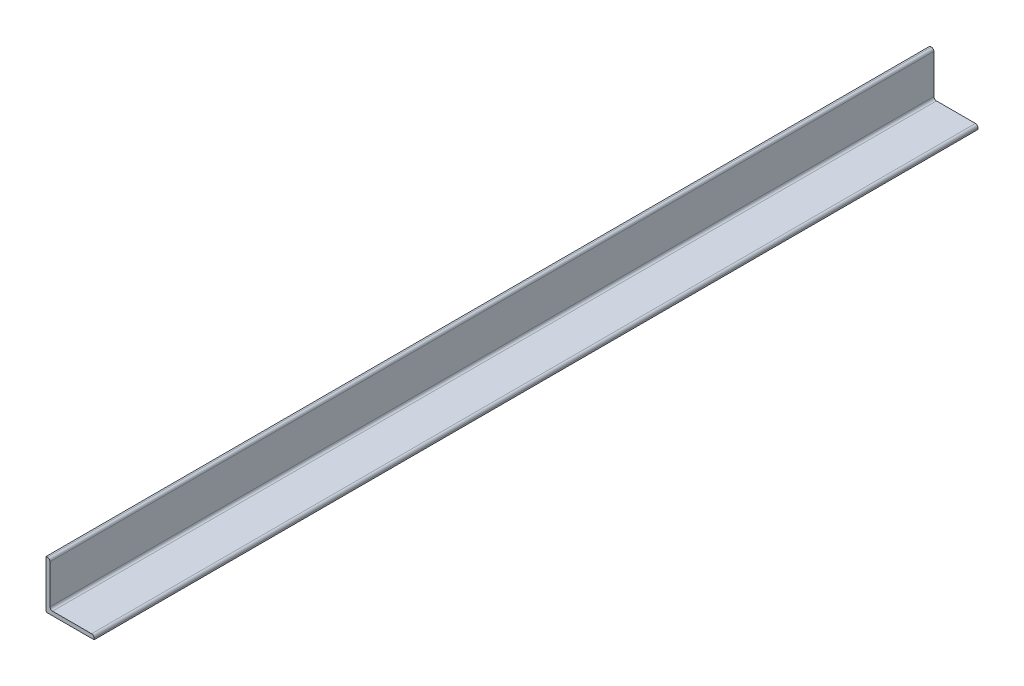
ISO-10303-21;
HEADER;
FILE_DESCRIPTION(('STEP AP214'),'2;1');
FILE_NAME('part.step','',(''),(''),'','','');
FILE_SCHEMA(('AUTOMOTIVE_DESIGN { 1 0 10303 214 1 1 1 1 }'));
ENDSEC;
DATA;
#1=APPLICATION_CONTEXT('core data for automotive mechanical design processes');
#2=APPLICATION_PROTOCOL_DEFINITION('international standard','automotive_design',2000,#1);
#3=PRODUCT_CONTEXT('',#1,'mechanical');
#4=PRODUCT('Part','Part','',(#3));
#5=PRODUCT_RELATED_PRODUCT_CATEGORY('part','',(#4));
#6=PRODUCT_DEFINITION_FORMATION('','',#4);
#7=PRODUCT_DEFINITION_CONTEXT('part definition',#1,'design');
#8=PRODUCT_DEFINITION('design','',#6,#7);
#9=PRODUCT_DEFINITION_SHAPE('','',#8);
#10=(LENGTH_UNIT() NAMED_UNIT(*) SI_UNIT(.MILLI.,.METRE.));
#11=(NAMED_UNIT(*) PLANE_ANGLE_UNIT() SI_UNIT($,.RADIAN.));
#12=(NAMED_UNIT(*) SI_UNIT($,.STERADIAN.) SOLID_ANGLE_UNIT());
#13=UNCERTAINTY_MEASURE_WITH_UNIT(LENGTH_MEASURE(1.E-05),#10,'distance_accuracy_value','');
#14=(GEOMETRIC_REPRESENTATION_CONTEXT(3) GLOBAL_UNCERTAINTY_ASSIGNED_CONTEXT((#13)) GLOBAL_UNIT_ASSIGNED_CONTEXT((#10,
#11,#12)) REPRESENTATION_CONTEXT('',''));
#15=CARTESIAN_POINT('',(0.,0.,0.));
#16=DIRECTION('',(0.,0.,1.));
#17=DIRECTION('',(1.,0.,0.));
#18=AXIS2_PLACEMENT_3D('',#15,#16,#17);
#19=CARTESIAN_POINT('',(19.05,0.,350.));
#20=DIRECTION('',(0.,1.,0.));
#21=DIRECTION('',(-1.,0.,0.));
#22=AXIS2_PLACEMENT_3D('',#19,#20,#21);
#23=PLANE('',#22);
#24=DIRECTION('',(1.,0.,0.));
#25=VECTOR('',#24,1.);
#26=CARTESIAN_POINT('',(19.05,0.,350.));
#27=LINE('',#26,#25);
#28=CARTESIAN_POINT('',(0.500000000000007,0.,350.));
#29=VERTEX_POINT('',#28);
#30=CARTESIAN_POINT('',(19.05,0.,350.));
#31=VERTEX_POINT('',#30);
#32=EDGE_CURVE('E109',#29,#31,#27,.T.);
#33=ORIENTED_EDGE('',*,*,#32,.F.);
#34=DIRECTION('',(0.,0.,-1.));
#35=VECTOR('',#34,1.);
#36=CARTESIAN_POINT('',(0.5,0.,350.));
#37=LINE('',#36,#35);
#38=CARTESIAN_POINT('',(0.500000000000007,0.,0.));
#39=VERTEX_POINT('',#38);
#40=EDGE_CURVE('E165',#29,#39,#37,.T.);
#41=ORIENTED_EDGE('',*,*,#40,.T.);
#42=DIRECTION('',(1.,0.,0.));
#43=VECTOR('',#42,1.);
#44=CARTESIAN_POINT('',(19.05,0.,0.));
#45=LINE('',#44,#43);
#46=CARTESIAN_POINT('',(19.05,0.,0.));
#47=VERTEX_POINT('',#46);
#48=EDGE_CURVE('E130',#39,#47,#45,.T.);
#49=ORIENTED_EDGE('',*,*,#48,.T.);
#50=DIRECTION('',(0.,0.,-1.));
#51=VECTOR('',#50,1.);
#52=CARTESIAN_POINT('',(19.05,0.,350.));
#53=LINE('',#52,#51);
#54=EDGE_CURVE('E125',#31,#47,#53,.T.);
#55=ORIENTED_EDGE('',*,*,#54,.F.);
#56=EDGE_LOOP('',(#33,#41,#49,#55));
#57=FACE_BOUND('',#56,.T.);
#58=ADVANCED_FACE('F32',(#57),#23,.F.);
#59=CARTESIAN_POINT('',(19.05,1.5875,350.));
#60=DIRECTION('',(-1.,0.,0.));
#61=DIRECTION('',(0.,0.,1.));
#62=AXIS2_PLACEMENT_3D('',#59,#60,#61);
#63=PLANE('',#62);
#64=DIRECTION('',(0.,1.,0.));
#65=VECTOR('',#64,1.);
#66=CARTESIAN_POINT('',(19.05,1.5875,0.));
#67=LINE('',#66,#65);
#68=CARTESIAN_POINT('',(19.05,0.5875,0.));
#69=VERTEX_POINT('',#68);
#70=EDGE_CURVE('E169',#47,#69,#67,.T.);
#71=ORIENTED_EDGE('',*,*,#70,.T.);
#72=DIRECTION('',(0.,0.,-1.));
#73=VECTOR('',#72,1.);
#74=CARTESIAN_POINT('',(19.05,0.5875,350.));
#75=LINE('',#74,#73);
#76=CARTESIAN_POINT('',(19.05,0.5875,350.));
#77=VERTEX_POINT('',#76);
#78=EDGE_CURVE('E127',#69,#77,#75,.F.);
#79=ORIENTED_EDGE('',*,*,#78,.T.);
#80=DIRECTION('',(0.,1.,0.));
#81=VECTOR('',#80,1.);
#82=CARTESIAN_POINT('',(19.05,1.5875,350.));
#83=LINE('',#82,#81);
#84=EDGE_CURVE('E112',#31,#77,#83,.T.);
#85=ORIENTED_EDGE('',*,*,#84,.F.);
#86=ORIENTED_EDGE('',*,*,#54,.T.);
#87=EDGE_LOOP('',(#71,#79,#85,#86));
#88=FACE_BOUND('',#87,.T.);
#89=ADVANCED_FACE('F124',(#88),#63,.F.);
#90=CARTESIAN_POINT('',(1.5875,1.5875,350.));
#91=DIRECTION('',(0.,-1.,0.));
#92=DIRECTION('',(0.,0.,-1.));
#93=AXIS2_PLACEMENT_3D('',#90,#91,#92);
#94=PLANE('',#93);
#95=DIRECTION('',(-1.,0.,0.));
#96=VECTOR('',#95,1.);
#97=CARTESIAN_POINT('',(1.5875,1.5875,350.));
#98=LINE('',#97,#96);
#99=CARTESIAN_POINT('',(18.05,1.5875,350.));
#100=VERTEX_POINT('',#99);
#101=CARTESIAN_POINT('',(2.5875,1.5875,350.));
#102=VERTEX_POINT('',#101);
#103=EDGE_CURVE('E128',#100,#102,#98,.T.);
#104=ORIENTED_EDGE('',*,*,#103,.F.);
#105=DIRECTION('',(0.,0.,-1.));
#106=VECTOR('',#105,1.);
#107=CARTESIAN_POINT('',(18.05,1.5875,350.));
#108=LINE('',#107,#106);
#109=CARTESIAN_POINT('',(18.05,1.5875,0.));
#110=VERTEX_POINT('',#109);
#111=EDGE_CURVE('E135',#100,#110,#108,.T.);
#112=ORIENTED_EDGE('',*,*,#111,.T.);
#113=DIRECTION('',(-1.,0.,0.));
#114=VECTOR('',#113,1.);
#115=CARTESIAN_POINT('',(1.5875,1.5875,0.));
#116=LINE('',#115,#114);
#117=CARTESIAN_POINT('',(2.5875,1.5875,0.));
#118=VERTEX_POINT('',#117);
#119=EDGE_CURVE('E171',#110,#118,#116,.T.);
#120=ORIENTED_EDGE('',*,*,#119,.T.);
#121=DIRECTION('',(0.,0.,-1.));
#122=VECTOR('',#121,1.);
#123=CARTESIAN_POINT('',(2.5875,1.5875,350.));
#124=LINE('',#123,#122);
#125=EDGE_CURVE('E132',#118,#102,#124,.F.);
#126=ORIENTED_EDGE('',*,*,#125,.T.);
#127=EDGE_LOOP('',(#104,#112,#120,#126));
#128=FACE_BOUND('',#127,.T.);
#129=ADVANCED_FACE('F197',(#128),#94,.F.);
#130=CARTESIAN_POINT('',(1.5875,19.05,350.));
#131=DIRECTION('',(-1.,0.,0.));
#132=DIRECTION('',(0.,-1.,0.));
#133=AXIS2_PLACEMENT_3D('',#130,#131,#132);
#134=PLANE('',#133);
#135=DIRECTION('',(0.,1.,0.));
#136=VECTOR('',#135,1.);
#137=CARTESIAN_POINT('',(1.5875,19.05,350.));
#138=LINE('',#137,#136);
#139=CARTESIAN_POINT('',(1.5875,2.5875,350.));
#140=VERTEX_POINT('',#139);
#141=CARTESIAN_POINT('',(1.5875,18.05,350.));
#142=VERTEX_POINT('',#141);
#143=EDGE_CURVE('E215',#140,#142,#138,.T.);
#144=ORIENTED_EDGE('',*,*,#143,.F.);
#145=DIRECTION('',(0.,0.,-1.));
#146=VECTOR('',#145,1.);
#147=CARTESIAN_POINT('',(1.5875,2.5875,0.));
#148=LINE('',#147,#146);
#149=CARTESIAN_POINT('',(1.5875,2.5875,0.));
#150=VERTEX_POINT('',#149);
#151=EDGE_CURVE('E155',#140,#150,#148,.T.);
#152=ORIENTED_EDGE('',*,*,#151,.T.);
#153=DIRECTION('',(0.,1.,0.));
#154=VECTOR('',#153,1.);
#155=CARTESIAN_POINT('',(1.5875,19.05,0.));
#156=LINE('',#155,#154);
#157=CARTESIAN_POINT('',(1.5875,18.05,0.));
#158=VERTEX_POINT('',#157);
#159=EDGE_CURVE('E178',#150,#158,#156,.T.);
#160=ORIENTED_EDGE('',*,*,#159,.T.);
#161=DIRECTION('',(0.,0.,-1.));
#162=VECTOR('',#161,1.);
#163=CARTESIAN_POINT('',(1.5875,18.05,350.));
#164=LINE('',#163,#162);
#165=EDGE_CURVE('E153',#158,#142,#164,.F.);
#166=ORIENTED_EDGE('',*,*,#165,.T.);
#167=EDGE_LOOP('',(#144,#152,#160,#166));
#168=FACE_BOUND('',#167,.T.);
#169=ADVANCED_FACE('F219',(#168),#134,.F.);
#170=CARTESIAN_POINT('',(0.,19.05,350.));
#171=DIRECTION('',(0.,-1.,0.));
#172=DIRECTION('',(0.,0.,-1.));
#173=AXIS2_PLACEMENT_3D('',#170,#171,#172);
#174=PLANE('',#173);
#175=DIRECTION('',(-1.,0.,0.));
#176=VECTOR('',#175,1.);
#177=CARTESIAN_POINT('',(0.,19.05,350.));
#178=LINE('',#177,#176);
#179=CARTESIAN_POINT('',(0.5875,19.05,350.));
#180=VERTEX_POINT('',#179);
#181=CARTESIAN_POINT('',(0.,19.05,350.));
#182=VERTEX_POINT('',#181);
#183=EDGE_CURVE('E222',#180,#182,#178,.T.);
#184=ORIENTED_EDGE('',*,*,#183,.F.);
#185=DIRECTION('',(0.,0.,-1.));
#186=VECTOR('',#185,1.);
#187=CARTESIAN_POINT('',(0.5875,19.05,350.));
#188=LINE('',#187,#186);
#189=CARTESIAN_POINT('',(0.5875,19.05,0.));
#190=VERTEX_POINT('',#189);
#191=EDGE_CURVE('E158',#180,#190,#188,.T.);
#192=ORIENTED_EDGE('',*,*,#191,.T.);
#193=DIRECTION('',(-1.,0.,0.));
#194=VECTOR('',#193,1.);
#195=CARTESIAN_POINT('',(0.,19.05,0.));
#196=LINE('',#195,#194);
#197=CARTESIAN_POINT('',(0.,19.05,0.));
#198=VERTEX_POINT('',#197);
#199=EDGE_CURVE('E181',#190,#198,#196,.T.);
#200=ORIENTED_EDGE('',*,*,#199,.T.);
#201=DIRECTION('',(0.,0.,-1.));
#202=VECTOR('',#201,1.);
#203=CARTESIAN_POINT('',(0.,19.05,350.));
#204=LINE('',#203,#202);
#205=EDGE_CURVE('E133',#182,#198,#204,.T.);
#206=ORIENTED_EDGE('',*,*,#205,.F.);
#207=EDGE_LOOP('',(#184,#192,#200,#206));
#208=FACE_BOUND('',#207,.T.);
#209=ADVANCED_FACE('F228',(#208),#174,.F.);
#210=CARTESIAN_POINT('',(0.,0.,350.));
#211=DIRECTION('',(1.,0.,0.));
#212=DIRECTION('',(0.,0.,-1.));
#213=AXIS2_PLACEMENT_3D('',#210,#211,#212);
#214=PLANE('',#213);
#215=DIRECTION('',(0.,-1.,0.));
#216=VECTOR('',#215,1.);
#217=CARTESIAN_POINT('',(0.,0.,0.));
#218=LINE('',#217,#216);
#219=CARTESIAN_POINT('',(0.,0.5,0.));
#220=VERTEX_POINT('',#219);
#221=EDGE_CURVE('E119',#198,#220,#218,.T.);
#222=ORIENTED_EDGE('',*,*,#221,.T.);
#223=DIRECTION('',(0.,0.,-1.));
#224=VECTOR('',#223,1.);
#225=CARTESIAN_POINT('',(0.,0.5,350.));
#226=LINE('',#225,#224);
#227=CARTESIAN_POINT('',(0.,0.5,350.));
#228=VERTEX_POINT('',#227);
#229=EDGE_CURVE('E40',#220,#228,#226,.F.);
#230=ORIENTED_EDGE('',*,*,#229,.T.);
#231=DIRECTION('',(0.,-1.,0.));
#232=VECTOR('',#231,1.);
#233=CARTESIAN_POINT('',(0.,0.,350.));
#234=LINE('',#233,#232);
#235=EDGE_CURVE('E138',#182,#228,#234,.T.);
#236=ORIENTED_EDGE('',*,*,#235,.F.);
#237=ORIENTED_EDGE('',*,*,#205,.T.);
#238=EDGE_LOOP('',(#222,#230,#236,#237));
#239=FACE_BOUND('',#238,.T.);
#240=ADVANCED_FACE('F182',(#239),#214,.F.);
#241=CARTESIAN_POINT('',(0.,0.,350.));
#242=DIRECTION('',(0.,0.,-1.));
#243=DIRECTION('',(-1.,0.,0.));
#244=AXIS2_PLACEMENT_3D('',#241,#242,#243);
#245=PLANE('',#244);
#246=ORIENTED_EDGE('',*,*,#235,.T.);
#247=CARTESIAN_POINT('',(0.5,0.5,350.));
#248=DIRECTION('',(0.,0.,-1.));
#249=DIRECTION('',(-1.,0.,0.));
#250=AXIS2_PLACEMENT_3D('',#247,#248,#249);
#251=CIRCLE('',#250,0.5);
#252=EDGE_CURVE('E11',#228,#29,#251,.F.);
#253=ORIENTED_EDGE('',*,*,#252,.T.);
#254=ORIENTED_EDGE('',*,*,#32,.T.);
#255=ORIENTED_EDGE('',*,*,#84,.T.);
#256=CARTESIAN_POINT('',(18.05,0.5875,350.));
#257=DIRECTION('',(0.,0.,-1.));
#258=DIRECTION('',(-1.,0.,0.));
#259=AXIS2_PLACEMENT_3D('',#256,#257,#258);
#260=CIRCLE('',#259,1.);
#261=EDGE_CURVE('E151',#77,#100,#260,.F.);
#262=ORIENTED_EDGE('',*,*,#261,.T.);
#263=ORIENTED_EDGE('',*,*,#103,.T.);
#264=CARTESIAN_POINT('',(2.5875,2.5875,350.));
#265=DIRECTION('',(0.,0.,-1.));
#266=DIRECTION('',(-1.,0.,0.));
#267=AXIS2_PLACEMENT_3D('',#264,#265,#266);
#268=CIRCLE('',#267,1.);
#269=EDGE_CURVE('E163',#102,#140,#268,.T.);
#270=ORIENTED_EDGE('',*,*,#269,.T.);
#271=ORIENTED_EDGE('',*,*,#143,.T.);
#272=CARTESIAN_POINT('',(0.5875,18.05,350.));
#273=DIRECTION('',(0.,0.,-1.));
#274=DIRECTION('',(-1.,0.,0.));
#275=AXIS2_PLACEMENT_3D('',#272,#273,#274);
#276=CIRCLE('',#275,1.);
#277=EDGE_CURVE('E149',#142,#180,#276,.F.);
#278=ORIENTED_EDGE('',*,*,#277,.T.);
#279=ORIENTED_EDGE('',*,*,#183,.T.);
#280=EDGE_LOOP('',(#246,#253,#254,#255,#262,#263,#270,#271,#278,#279));
#281=FACE_BOUND('',#280,.T.);
#282=ADVANCED_FACE('F111',(#281),#245,.F.);
#283=CARTESIAN_POINT('',(0.,0.,0.));
#284=DIRECTION('',(0.,0.,-1.));
#285=DIRECTION('',(-1.,0.,0.));
#286=AXIS2_PLACEMENT_3D('',#283,#284,#285);
#287=PLANE('',#286);
#288=ORIENTED_EDGE('',*,*,#48,.F.);
#289=CARTESIAN_POINT('',(0.5,0.5,0.));
#290=DIRECTION('',(0.,0.,-1.));
#291=DIRECTION('',(-1.,0.,0.));
#292=AXIS2_PLACEMENT_3D('',#289,#290,#291);
#293=CIRCLE('',#292,0.5);
#294=EDGE_CURVE('E54',#39,#220,#293,.T.);
#295=ORIENTED_EDGE('',*,*,#294,.T.);
#296=ORIENTED_EDGE('',*,*,#221,.F.);
#297=ORIENTED_EDGE('',*,*,#199,.F.);
#298=CARTESIAN_POINT('',(0.5875,18.05,0.));
#299=DIRECTION('',(0.,0.,-1.));
#300=DIRECTION('',(-1.,0.,0.));
#301=AXIS2_PLACEMENT_3D('',#298,#299,#300);
#302=CIRCLE('',#301,1.);
#303=EDGE_CURVE('E144',#190,#158,#302,.T.);
#304=ORIENTED_EDGE('',*,*,#303,.T.);
#305=ORIENTED_EDGE('',*,*,#159,.F.);
#306=CARTESIAN_POINT('',(2.5875,2.5875,0.));
#307=DIRECTION('',(0.,0.,-1.));
#308=DIRECTION('',(-1.,0.,0.));
#309=AXIS2_PLACEMENT_3D('',#306,#307,#308);
#310=CIRCLE('',#309,1.);
#311=EDGE_CURVE('E161',#150,#118,#310,.F.);
#312=ORIENTED_EDGE('',*,*,#311,.T.);
#313=ORIENTED_EDGE('',*,*,#119,.F.);
#314=CARTESIAN_POINT('',(18.05,0.5875,0.));
#315=DIRECTION('',(0.,0.,-1.));
#316=DIRECTION('',(-1.,0.,0.));
#317=AXIS2_PLACEMENT_3D('',#314,#315,#316);
#318=CIRCLE('',#317,1.);
#319=EDGE_CURVE('E146',#110,#69,#318,.T.);
#320=ORIENTED_EDGE('',*,*,#319,.T.);
#321=ORIENTED_EDGE('',*,*,#70,.F.);
#322=EDGE_LOOP('',(#288,#295,#296,#297,#304,#305,#312,#313,#320,#321));
#323=FACE_BOUND('',#322,.T.);
#324=ADVANCED_FACE('F168',(#323),#287,.T.);
#325=CARTESIAN_POINT('',(18.05,0.5875,350.));
#326=DIRECTION('',(0.,0.,-1.));
#327=DIRECTION('',(-1.,0.,0.));
#328=AXIS2_PLACEMENT_3D('',#325,#326,#327);
#329=CYLINDRICAL_SURFACE('',#328,1.);
#330=ORIENTED_EDGE('',*,*,#261,.F.);
#331=ORIENTED_EDGE('',*,*,#78,.F.);
#332=ORIENTED_EDGE('',*,*,#319,.F.);
#333=ORIENTED_EDGE('',*,*,#111,.F.);
#334=EDGE_LOOP('',(#330,#331,#332,#333));
#335=FACE_BOUND('',#334,.T.);
#336=ADVANCED_FACE('F201',(#335),#329,.T.);
#337=CARTESIAN_POINT('',(2.5875,2.5875,350.));
#338=DIRECTION('',(0.,0.,1.));
#339=DIRECTION('',(1.,0.,0.));
#340=AXIS2_PLACEMENT_3D('',#337,#338,#339);
#341=CYLINDRICAL_SURFACE('',#340,1.);
#342=ORIENTED_EDGE('',*,*,#269,.F.);
#343=ORIENTED_EDGE('',*,*,#125,.F.);
#344=ORIENTED_EDGE('',*,*,#311,.F.);
#345=ORIENTED_EDGE('',*,*,#151,.F.);
#346=EDGE_LOOP('',(#342,#343,#344,#345));
#347=FACE_BOUND('',#346,.T.);
#348=ADVANCED_FACE('F190',(#347),#341,.F.);
#349=CARTESIAN_POINT('',(0.5875,18.05,350.));
#350=DIRECTION('',(0.,0.,-1.));
#351=DIRECTION('',(-1.,0.,0.));
#352=AXIS2_PLACEMENT_3D('',#349,#350,#351);
#353=CYLINDRICAL_SURFACE('',#352,1.);
#354=ORIENTED_EDGE('',*,*,#277,.F.);
#355=ORIENTED_EDGE('',*,*,#165,.F.);
#356=ORIENTED_EDGE('',*,*,#303,.F.);
#357=ORIENTED_EDGE('',*,*,#191,.F.);
#358=EDGE_LOOP('',(#354,#355,#356,#357));
#359=FACE_BOUND('',#358,.T.);
#360=ADVANCED_FACE('F186',(#359),#353,.T.);
#361=CARTESIAN_POINT('',(0.5,0.5,350.));
#362=DIRECTION('',(0.,0.,-1.));
#363=DIRECTION('',(-1.,0.,0.));
#364=AXIS2_PLACEMENT_3D('',#361,#362,#363);
#365=CYLINDRICAL_SURFACE('',#364,0.5);
#366=ORIENTED_EDGE('',*,*,#252,.F.);
#367=ORIENTED_EDGE('',*,*,#229,.F.);
#368=ORIENTED_EDGE('',*,*,#294,.F.);
#369=ORIENTED_EDGE('',*,*,#40,.F.);
#370=EDGE_LOOP('',(#366,#367,#368,#369));
#371=FACE_BOUND('',#370,.T.);
#372=ADVANCED_FACE('F34',(#371),#365,.T.);
#373=CLOSED_SHELL('',(#58,#89,#129,#169,#209,#240,#282,#324,#336,#348,#360,#372));
#374=MANIFOLD_SOLID_BREP('B2',#373);
#375=ADVANCED_BREP_SHAPE_REPRESENTATION('',(#18,#374),#14);
#376=SHAPE_DEFINITION_REPRESENTATION(#9,#375);
ENDSEC;
END-ISO-10303-21;
